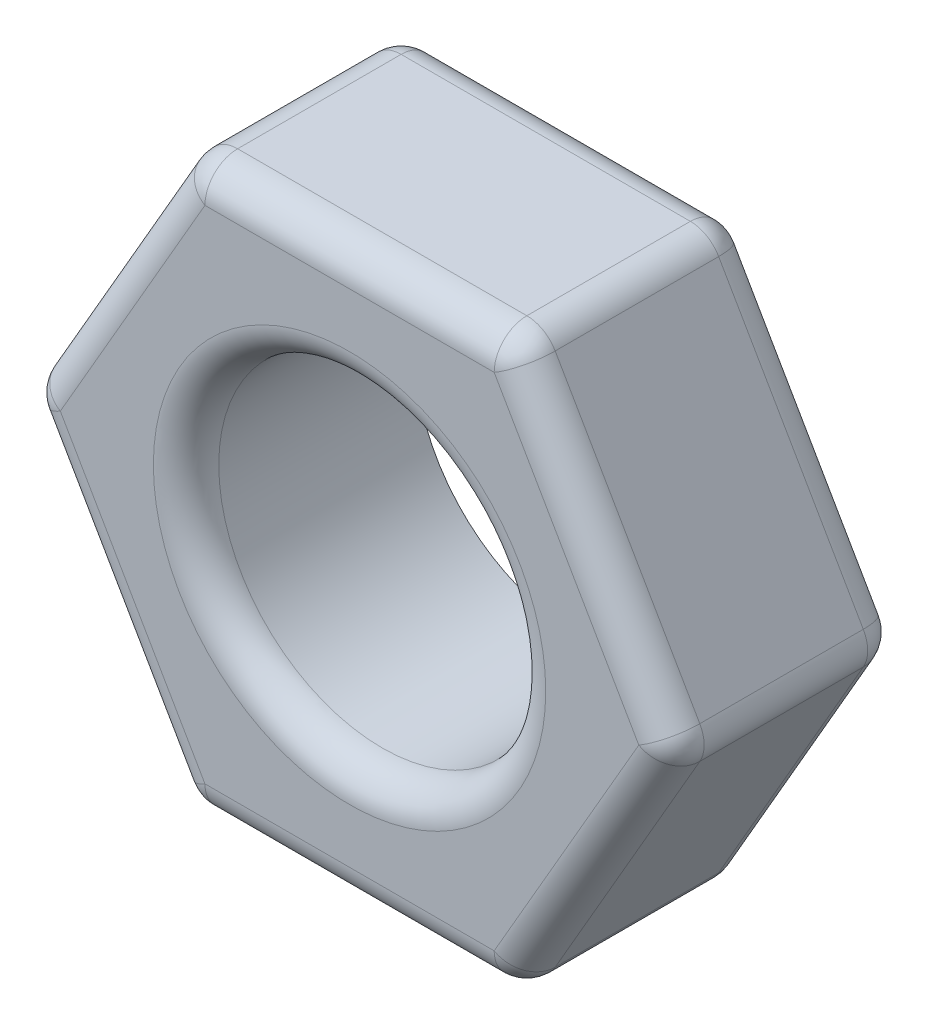
ISO-10303-21;
HEADER;
FILE_DESCRIPTION(('STEP AP214'),'2;1');
FILE_NAME('part.step','',(''),(''),'','','');
FILE_SCHEMA(('AUTOMOTIVE_DESIGN { 1 0 10303 214 1 1 1 1 }'));
ENDSEC;
DATA;
#1=APPLICATION_CONTEXT('core data for automotive mechanical design processes');
#2=APPLICATION_PROTOCOL_DEFINITION('international standard','automotive_design',2000,#1);
#3=PRODUCT_CONTEXT('',#1,'mechanical');
#4=PRODUCT('Part','Part','',(#3));
#5=PRODUCT_RELATED_PRODUCT_CATEGORY('part','',(#4));
#6=PRODUCT_DEFINITION_FORMATION('','',#4);
#7=PRODUCT_DEFINITION_CONTEXT('part definition',#1,'design');
#8=PRODUCT_DEFINITION('design','',#6,#7);
#9=PRODUCT_DEFINITION_SHAPE('','',#8);
#10=(LENGTH_UNIT() NAMED_UNIT(*) SI_UNIT(.MILLI.,.METRE.));
#11=(NAMED_UNIT(*) PLANE_ANGLE_UNIT() SI_UNIT($,.RADIAN.));
#12=(NAMED_UNIT(*) SI_UNIT($,.STERADIAN.) SOLID_ANGLE_UNIT());
#13=UNCERTAINTY_MEASURE_WITH_UNIT(LENGTH_MEASURE(1.E-05),#10,'distance_accuracy_value','');
#14=(GEOMETRIC_REPRESENTATION_CONTEXT(3) GLOBAL_UNCERTAINTY_ASSIGNED_CONTEXT((#13)) GLOBAL_UNIT_ASSIGNED_CONTEXT((#10,
#11,#12)) REPRESENTATION_CONTEXT('',''));
#15=CARTESIAN_POINT('',(0.,0.,0.));
#16=DIRECTION('',(0.,0.,1.));
#17=DIRECTION('',(1.,0.,0.));
#18=AXIS2_PLACEMENT_3D('',#15,#16,#17);
#19=CARTESIAN_POINT('',(0.,0.,7.));
#20=DIRECTION('',(0.,0.,1.));
#21=DIRECTION('',(1.,0.,0.));
#22=AXIS2_PLACEMENT_3D('',#19,#20,#21);
#23=PLANE('',#22);
#24=DIRECTION('',(-0.5,0.866025403784439,0.));
#25=VECTOR('',#24,1.);
#26=CARTESIAN_POINT('',(4.42264973081037,7.66025403784439,7.));
#27=LINE('',#26,#25);
#28=CARTESIAN_POINT('',(8.84529946162075,0.,7.));
#29=VERTEX_POINT('',#28);
#30=CARTESIAN_POINT('',(4.42264973081037,7.66025403784439,7.));
#31=VERTEX_POINT('',#30);
#32=EDGE_CURVE('E54',#29,#31,#27,.T.);
#33=ORIENTED_EDGE('',*,*,#32,.T.);
#34=DIRECTION('',(-1.,0.,0.));
#35=VECTOR('',#34,1.);
#36=CARTESIAN_POINT('',(-4.42264973081037,7.66025403784439,7.));
#37=LINE('',#36,#35);
#38=CARTESIAN_POINT('',(-4.42264973081037,7.66025403784439,7.));
#39=VERTEX_POINT('',#38);
#40=EDGE_CURVE('E280',#31,#39,#37,.T.);
#41=ORIENTED_EDGE('',*,*,#40,.T.);
#42=DIRECTION('',(-0.5,-0.866025403784439,0.));
#43=VECTOR('',#42,1.);
#44=CARTESIAN_POINT('',(-8.84529946162075,0.,7.));
#45=LINE('',#44,#43);
#46=CARTESIAN_POINT('',(-8.84529946162075,0.,7.));
#47=VERTEX_POINT('',#46);
#48=EDGE_CURVE('E305',#39,#47,#45,.T.);
#49=ORIENTED_EDGE('',*,*,#48,.T.);
#50=DIRECTION('',(0.5,-0.866025403784439,0.));
#51=VECTOR('',#50,1.);
#52=CARTESIAN_POINT('',(-4.42264973081038,-7.66025403784439,7.));
#53=LINE('',#52,#51);
#54=CARTESIAN_POINT('',(-4.42264973081037,-7.66025403784439,7.));
#55=VERTEX_POINT('',#54);
#56=EDGE_CURVE('E282',#47,#55,#53,.T.);
#57=ORIENTED_EDGE('',*,*,#56,.T.);
#58=DIRECTION('',(1.,0.,0.));
#59=VECTOR('',#58,1.);
#60=CARTESIAN_POINT('',(4.42264973081037,-7.66025403784439,7.));
#61=LINE('',#60,#59);
#62=CARTESIAN_POINT('',(4.42264973081037,-7.66025403784439,7.));
#63=VERTEX_POINT('',#62);
#64=EDGE_CURVE('E270',#55,#63,#61,.T.);
#65=ORIENTED_EDGE('',*,*,#64,.T.);
#66=DIRECTION('',(0.5,0.866025403784439,0.));
#67=VECTOR('',#66,1.);
#68=CARTESIAN_POINT('',(8.84529946162075,0.,7.));
#69=LINE('',#68,#67);
#70=EDGE_CURVE('E59',#63,#29,#69,.T.);
#71=ORIENTED_EDGE('',*,*,#70,.T.);
#72=EDGE_LOOP('',(#33,#41,#49,#57,#65,#71));
#73=FACE_BOUND('',#72,.T.);
#74=CARTESIAN_POINT('',(0.,0.,7.));
#75=DIRECTION('',(0.,0.,1.));
#76=DIRECTION('',(1.,0.,0.));
#77=AXIS2_PLACEMENT_3D('',#74,#75,#76);
#78=CIRCLE('',#77,6.);
#79=CARTESIAN_POINT('',(6.,0.,7.));
#80=VERTEX_POINT('',#79);
#81=EDGE_CURVE('E398',#80,#80,#78,.F.);
#82=ORIENTED_EDGE('',*,*,#81,.T.);
#83=EDGE_LOOP('',(#82));
#84=FACE_BOUND('',#83,.T.);
#85=ADVANCED_FACE('F37',(#73,#84),#23,.T.);
#86=CARTESIAN_POINT('',(0.,0.,0.));
#87=DIRECTION('',(0.,0.,1.));
#88=DIRECTION('',(1.,0.,0.));
#89=AXIS2_PLACEMENT_3D('',#86,#87,#88);
#90=PLANE('',#89);
#91=DIRECTION('',(-0.5,-0.866025403784439,0.));
#92=VECTOR('',#91,1.);
#93=CARTESIAN_POINT('',(-6.63397459621556,3.83012701892219,0.));
#94=LINE('',#93,#92);
#95=CARTESIAN_POINT('',(-8.84529946162075,0.,0.));
#96=VERTEX_POINT('',#95);
#97=CARTESIAN_POINT('',(-4.42264973081037,7.66025403784439,0.));
#98=VERTEX_POINT('',#97);
#99=EDGE_CURVE('E173',#96,#98,#94,.F.);
#100=ORIENTED_EDGE('',*,*,#99,.T.);
#101=DIRECTION('',(-1.,0.,0.));
#102=VECTOR('',#101,1.);
#103=CARTESIAN_POINT('',(0.,7.66025403784439,0.));
#104=LINE('',#103,#102);
#105=CARTESIAN_POINT('',(4.42264973081037,7.66025403784439,0.));
#106=VERTEX_POINT('',#105);
#107=EDGE_CURVE('E198',#98,#106,#104,.F.);
#108=ORIENTED_EDGE('',*,*,#107,.T.);
#109=DIRECTION('',(-0.5,0.866025403784439,0.));
#110=VECTOR('',#109,1.);
#111=CARTESIAN_POINT('',(6.63397459621556,3.83012701892219,0.));
#112=LINE('',#111,#110);
#113=CARTESIAN_POINT('',(8.84529946162075,0.,0.));
#114=VERTEX_POINT('',#113);
#115=EDGE_CURVE('E323',#106,#114,#112,.F.);
#116=ORIENTED_EDGE('',*,*,#115,.T.);
#117=DIRECTION('',(0.5,0.866025403784439,0.));
#118=VECTOR('',#117,1.);
#119=CARTESIAN_POINT('',(6.63397459621556,-3.83012701892219,0.));
#120=LINE('',#119,#118);
#121=CARTESIAN_POINT('',(4.42264973081037,-7.66025403784439,0.));
#122=VERTEX_POINT('',#121);
#123=EDGE_CURVE('E321',#114,#122,#120,.F.);
#124=ORIENTED_EDGE('',*,*,#123,.T.);
#125=DIRECTION('',(1.,0.,0.));
#126=VECTOR('',#125,1.);
#127=CARTESIAN_POINT('',(0.,-7.66025403784439,0.));
#128=LINE('',#127,#126);
#129=CARTESIAN_POINT('',(-4.42264973081037,-7.66025403784439,0.));
#130=VERTEX_POINT('',#129);
#131=EDGE_CURVE('E319',#122,#130,#128,.F.);
#132=ORIENTED_EDGE('',*,*,#131,.T.);
#133=DIRECTION('',(0.5,-0.866025403784439,0.));
#134=VECTOR('',#133,1.);
#135=CARTESIAN_POINT('',(-6.63397459621556,-3.83012701892219,0.));
#136=LINE('',#135,#134);
#137=EDGE_CURVE('E317',#130,#96,#136,.F.);
#138=ORIENTED_EDGE('',*,*,#137,.T.);
#139=EDGE_LOOP('',(#100,#108,#116,#124,#132,#138));
#140=FACE_BOUND('',#139,.T.);
#141=CARTESIAN_POINT('',(0.,0.,0.));
#142=DIRECTION('',(0.,0.,1.));
#143=DIRECTION('',(1.,0.,0.));
#144=AXIS2_PLACEMENT_3D('',#141,#142,#143);
#145=CIRCLE('',#144,5.);
#146=CARTESIAN_POINT('',(5.,0.,0.));
#147=VERTEX_POINT('',#146);
#148=EDGE_CURVE('E234',#147,#147,#145,.T.);
#149=ORIENTED_EDGE('',*,*,#148,.T.);
#150=EDGE_LOOP('',(#149));
#151=FACE_BOUND('',#150,.T.);
#152=ADVANCED_FACE('F407',(#140,#151),#90,.F.);
#153=CARTESIAN_POINT('',(5.,-8.66025403784439,7.));
#154=DIRECTION('',(-0.866025403784439,0.5,0.));
#155=DIRECTION('',(-0.5,-0.866025403784439,0.));
#156=AXIS2_PLACEMENT_3D('',#153,#154,#155);
#157=PLANE('',#156);
#158=DIRECTION('',(0.,0.,-1.));
#159=VECTOR('',#158,1.);
#160=CARTESIAN_POINT('',(5.28867513459481,-8.16025403784439,7.));
#161=LINE('',#160,#159);
#162=CARTESIAN_POINT('',(5.28867513459481,-8.16025403784439,6.));
#163=VERTEX_POINT('',#162);
#164=CARTESIAN_POINT('',(5.28867513459481,-8.16025403784439,1.));
#165=VERTEX_POINT('',#164);
#166=EDGE_CURVE('E389',#163,#165,#161,.T.);
#167=ORIENTED_EDGE('',*,*,#166,.T.);
#168=DIRECTION('',(0.5,0.866025403784439,0.));
#169=VECTOR('',#168,1.);
#170=CARTESIAN_POINT('',(5.,-8.66025403784439,1.));
#171=LINE('',#170,#169);
#172=CARTESIAN_POINT('',(9.71132486540519,-0.499999999999999,1.));
#173=VERTEX_POINT('',#172);
#174=EDGE_CURVE('E340',#165,#173,#171,.T.);
#175=ORIENTED_EDGE('',*,*,#174,.T.);
#176=DIRECTION('',(0.,0.,-1.));
#177=VECTOR('',#176,1.);
#178=CARTESIAN_POINT('',(9.71132486540519,-0.499999999999999,7.));
#179=LINE('',#178,#177);
#180=CARTESIAN_POINT('',(9.71132486540519,-0.499999999999999,6.));
#181=VERTEX_POINT('',#180);
#182=EDGE_CURVE('E386',#173,#181,#179,.F.);
#183=ORIENTED_EDGE('',*,*,#182,.T.);
#184=DIRECTION('',(0.5,0.866025403784439,0.));
#185=VECTOR('',#184,1.);
#186=CARTESIAN_POINT('',(5.28867513459481,-8.16025403784439,6.));
#187=LINE('',#186,#185);
#188=EDGE_CURVE('E338',#181,#163,#187,.F.);
#189=ORIENTED_EDGE('',*,*,#188,.T.);
#190=EDGE_LOOP('',(#167,#175,#183,#189));
#191=FACE_BOUND('',#190,.T.);
#192=ADVANCED_FACE('F432',(#191),#157,.F.);
#193=CARTESIAN_POINT('',(10.,0.,7.));
#194=DIRECTION('',(-0.866025403784438,-0.5,0.));
#195=DIRECTION('',(0.5,-0.866025403784439,0.));
#196=AXIS2_PLACEMENT_3D('',#193,#194,#195);
#197=PLANE('',#196);
#198=DIRECTION('',(0.,0.,-1.));
#199=VECTOR('',#198,1.);
#200=CARTESIAN_POINT('',(9.71132486540519,0.500000000000002,7.));
#201=LINE('',#200,#199);
#202=CARTESIAN_POINT('',(9.71132486540519,0.500000000000002,6.));
#203=VERTEX_POINT('',#202);
#204=CARTESIAN_POINT('',(9.71132486540519,0.500000000000002,1.));
#205=VERTEX_POINT('',#204);
#206=EDGE_CURVE('E392',#203,#205,#201,.T.);
#207=ORIENTED_EDGE('',*,*,#206,.T.);
#208=DIRECTION('',(-0.5,0.866025403784439,0.));
#209=VECTOR('',#208,1.);
#210=CARTESIAN_POINT('',(10.,0.,1.));
#211=LINE('',#210,#209);
#212=CARTESIAN_POINT('',(5.28867513459481,8.16025403784439,1.));
#213=VERTEX_POINT('',#212);
#214=EDGE_CURVE('E332',#205,#213,#211,.T.);
#215=ORIENTED_EDGE('',*,*,#214,.T.);
#216=DIRECTION('',(0.,0.,-1.));
#217=VECTOR('',#216,1.);
#218=CARTESIAN_POINT('',(5.28867513459481,8.16025403784439,7.));
#219=LINE('',#218,#217);
#220=CARTESIAN_POINT('',(5.28867513459481,8.16025403784439,6.));
#221=VERTEX_POINT('',#220);
#222=EDGE_CURVE('E395',#213,#221,#219,.F.);
#223=ORIENTED_EDGE('',*,*,#222,.T.);
#224=DIRECTION('',(-0.5,0.866025403784439,0.));
#225=VECTOR('',#224,1.);
#226=CARTESIAN_POINT('',(9.71132486540519,0.500000000000001,6.));
#227=LINE('',#226,#225);
#228=EDGE_CURVE('E330',#221,#203,#227,.F.);
#229=ORIENTED_EDGE('',*,*,#228,.T.);
#230=EDGE_LOOP('',(#207,#215,#223,#229));
#231=FACE_BOUND('',#230,.T.);
#232=ADVANCED_FACE('F442',(#231),#197,.F.);
#233=CARTESIAN_POINT('',(5.,8.66025403784439,7.));
#234=DIRECTION('',(0.,-1.,0.));
#235=DIRECTION('',(0.,0.,-1.));
#236=AXIS2_PLACEMENT_3D('',#233,#234,#235);
#237=PLANE('',#236);
#238=DIRECTION('',(0.,0.,-1.));
#239=VECTOR('',#238,1.);
#240=CARTESIAN_POINT('',(4.42264973081037,8.66025403784439,7.));
#241=LINE('',#240,#239);
#242=CARTESIAN_POINT('',(4.42264973081037,8.66025403784439,6.));
#243=VERTEX_POINT('',#242);
#244=CARTESIAN_POINT('',(4.42264973081037,8.66025403784439,1.));
#245=VERTEX_POINT('',#244);
#246=EDGE_CURVE('E169',#243,#245,#241,.T.);
#247=ORIENTED_EDGE('',*,*,#246,.T.);
#248=DIRECTION('',(-1.,0.,0.));
#249=VECTOR('',#248,1.);
#250=CARTESIAN_POINT('',(5.,8.66025403784439,1.));
#251=LINE('',#250,#249);
#252=CARTESIAN_POINT('',(-4.42264973081037,8.66025403784439,1.));
#253=VERTEX_POINT('',#252);
#254=EDGE_CURVE('E164',#245,#253,#251,.T.);
#255=ORIENTED_EDGE('',*,*,#254,.T.);
#256=DIRECTION('',(0.,0.,-1.));
#257=VECTOR('',#256,1.);
#258=CARTESIAN_POINT('',(-4.42264973081037,8.66025403784439,7.));
#259=LINE('',#258,#257);
#260=CARTESIAN_POINT('',(-4.42264973081037,8.66025403784439,6.));
#261=VERTEX_POINT('',#260);
#262=EDGE_CURVE('E167',#253,#261,#259,.F.);
#263=ORIENTED_EDGE('',*,*,#262,.T.);
#264=DIRECTION('',(-1.,0.,0.));
#265=VECTOR('',#264,1.);
#266=CARTESIAN_POINT('',(4.42264973081037,8.66025403784439,6.));
#267=LINE('',#266,#265);
#268=EDGE_CURVE('E174',#261,#243,#267,.F.);
#269=ORIENTED_EDGE('',*,*,#268,.T.);
#270=EDGE_LOOP('',(#247,#255,#263,#269));
#271=FACE_BOUND('',#270,.T.);
#272=ADVANCED_FACE('F166',(#271),#237,.F.);
#273=CARTESIAN_POINT('',(-5.,8.66025403784439,7.));
#274=DIRECTION('',(0.866025403784439,-0.5,0.));
#275=DIRECTION('',(0.5,0.866025403784439,0.));
#276=AXIS2_PLACEMENT_3D('',#273,#274,#275);
#277=PLANE('',#276);
#278=DIRECTION('',(0.,0.,-1.));
#279=VECTOR('',#278,1.);
#280=CARTESIAN_POINT('',(-5.28867513459481,8.16025403784439,7.));
#281=LINE('',#280,#279);
#282=CARTESIAN_POINT('',(-5.28867513459481,8.16025403784439,6.));
#283=VERTEX_POINT('',#282);
#284=CARTESIAN_POINT('',(-5.28867513459481,8.16025403784439,1.));
#285=VERTEX_POINT('',#284);
#286=EDGE_CURVE('E290',#283,#285,#281,.T.);
#287=ORIENTED_EDGE('',*,*,#286,.T.);
#288=DIRECTION('',(-0.5,-0.866025403784439,0.));
#289=VECTOR('',#288,1.);
#290=CARTESIAN_POINT('',(-5.,8.66025403784439,1.));
#291=LINE('',#290,#289);
#292=CARTESIAN_POINT('',(-9.71132486540519,0.499999999999999,1.));
#293=VERTEX_POINT('',#292);
#294=EDGE_CURVE('E11',#285,#293,#291,.T.);
#295=ORIENTED_EDGE('',*,*,#294,.T.);
#296=DIRECTION('',(0.,0.,-1.));
#297=VECTOR('',#296,1.);
#298=CARTESIAN_POINT('',(-9.71132486540519,0.499999999999999,7.));
#299=LINE('',#298,#297);
#300=CARTESIAN_POINT('',(-9.71132486540519,0.499999999999999,6.));
#301=VERTEX_POINT('',#300);
#302=EDGE_CURVE('E292',#293,#301,#299,.F.);
#303=ORIENTED_EDGE('',*,*,#302,.T.);
#304=DIRECTION('',(-0.5,-0.866025403784439,0.));
#305=VECTOR('',#304,1.);
#306=CARTESIAN_POINT('',(-5.28867513459481,8.16025403784439,6.));
#307=LINE('',#306,#305);
#308=EDGE_CURVE('E46',#301,#283,#307,.F.);
#309=ORIENTED_EDGE('',*,*,#308,.T.);
#310=EDGE_LOOP('',(#287,#295,#303,#309));
#311=FACE_BOUND('',#310,.T.);
#312=ADVANCED_FACE('F289',(#311),#277,.F.);
#313=CARTESIAN_POINT('',(-10.,0.,7.));
#314=DIRECTION('',(0.866025403784439,0.5,0.));
#315=DIRECTION('',(-0.5,0.866025403784439,0.));
#316=AXIS2_PLACEMENT_3D('',#313,#314,#315);
#317=PLANE('',#316);
#318=DIRECTION('',(0.,0.,-1.));
#319=VECTOR('',#318,1.);
#320=CARTESIAN_POINT('',(-9.71132486540519,-0.500000000000002,7.));
#321=LINE('',#320,#319);
#322=CARTESIAN_POINT('',(-9.71132486540519,-0.500000000000002,6.));
#323=VERTEX_POINT('',#322);
#324=CARTESIAN_POINT('',(-9.71132486540519,-0.500000000000002,1.));
#325=VERTEX_POINT('',#324);
#326=EDGE_CURVE('E371',#323,#325,#321,.T.);
#327=ORIENTED_EDGE('',*,*,#326,.T.);
#328=DIRECTION('',(0.5,-0.866025403784439,0.));
#329=VECTOR('',#328,1.);
#330=CARTESIAN_POINT('',(-10.,0.,1.));
#331=LINE('',#330,#329);
#332=CARTESIAN_POINT('',(-5.28867513459481,-8.16025403784439,1.));
#333=VERTEX_POINT('',#332);
#334=EDGE_CURVE('E354',#325,#333,#331,.T.);
#335=ORIENTED_EDGE('',*,*,#334,.T.);
#336=DIRECTION('',(0.,0.,-1.));
#337=VECTOR('',#336,1.);
#338=CARTESIAN_POINT('',(-5.28867513459481,-8.16025403784439,7.));
#339=LINE('',#338,#337);
#340=CARTESIAN_POINT('',(-5.28867513459481,-8.16025403784439,6.));
#341=VERTEX_POINT('',#340);
#342=EDGE_CURVE('E296',#333,#341,#339,.F.);
#343=ORIENTED_EDGE('',*,*,#342,.T.);
#344=DIRECTION('',(0.5,-0.866025403784439,0.));
#345=VECTOR('',#344,1.);
#346=CARTESIAN_POINT('',(-9.71132486540519,-0.5,6.));
#347=LINE('',#346,#345);
#348=EDGE_CURVE('E352',#341,#323,#347,.F.);
#349=ORIENTED_EDGE('',*,*,#348,.T.);
#350=EDGE_LOOP('',(#327,#335,#343,#349));
#351=FACE_BOUND('',#350,.T.);
#352=ADVANCED_FACE('F423',(#351),#317,.F.);
#353=CARTESIAN_POINT('',(-5.,-8.66025403784439,7.));
#354=DIRECTION('',(0.,1.,0.));
#355=DIRECTION('',(-1.,0.,0.));
#356=AXIS2_PLACEMENT_3D('',#353,#354,#355);
#357=PLANE('',#356);
#358=DIRECTION('',(0.,0.,-1.));
#359=VECTOR('',#358,1.);
#360=CARTESIAN_POINT('',(-4.42264973081037,-8.66025403784439,7.));
#361=LINE('',#360,#359);
#362=CARTESIAN_POINT('',(-4.42264973081037,-8.66025403784439,6.));
#363=VERTEX_POINT('',#362);
#364=CARTESIAN_POINT('',(-4.42264973081037,-8.66025403784439,1.));
#365=VERTEX_POINT('',#364);
#366=EDGE_CURVE('E379',#363,#365,#361,.T.);
#367=ORIENTED_EDGE('',*,*,#366,.T.);
#368=DIRECTION('',(1.,0.,0.));
#369=VECTOR('',#368,1.);
#370=CARTESIAN_POINT('',(-5.,-8.66025403784439,1.));
#371=LINE('',#370,#369);
#372=CARTESIAN_POINT('',(4.42264973081037,-8.66025403784439,1.));
#373=VERTEX_POINT('',#372);
#374=EDGE_CURVE('E346',#365,#373,#371,.T.);
#375=ORIENTED_EDGE('',*,*,#374,.T.);
#376=DIRECTION('',(0.,0.,-1.));
#377=VECTOR('',#376,1.);
#378=CARTESIAN_POINT('',(4.42264973081037,-8.66025403784439,7.));
#379=LINE('',#378,#377);
#380=CARTESIAN_POINT('',(4.42264973081037,-8.66025403784439,6.));
#381=VERTEX_POINT('',#380);
#382=EDGE_CURVE('E374',#373,#381,#379,.F.);
#383=ORIENTED_EDGE('',*,*,#382,.T.);
#384=DIRECTION('',(1.,0.,0.));
#385=VECTOR('',#384,1.);
#386=CARTESIAN_POINT('',(-4.42264973081037,-8.66025403784439,6.));
#387=LINE('',#386,#385);
#388=EDGE_CURVE('E271',#381,#363,#387,.F.);
#389=ORIENTED_EDGE('',*,*,#388,.T.);
#390=EDGE_LOOP('',(#367,#375,#383,#389));
#391=FACE_BOUND('',#390,.T.);
#392=ADVANCED_FACE('F412',(#391),#357,.F.);
#393=CARTESIAN_POINT('',(0.,0.,7.));
#394=DIRECTION('',(0.,0.,-1.));
#395=DIRECTION('',(-1.,0.,0.));
#396=AXIS2_PLACEMENT_3D('',#393,#394,#395);
#397=CYLINDRICAL_SURFACE('',#396,5.);
#398=CARTESIAN_POINT('',(0.,0.,6.));
#399=DIRECTION('',(0.,0.,1.));
#400=DIRECTION('',(1.,0.,0.));
#401=AXIS2_PLACEMENT_3D('',#398,#399,#400);
#402=CIRCLE('',#401,5.);
#403=CARTESIAN_POINT('',(5.,0.,6.));
#404=VERTEX_POINT('',#403);
#405=EDGE_CURVE('E401',#404,#404,#402,.T.);
#406=ORIENTED_EDGE('',*,*,#405,.T.);
#407=EDGE_LOOP('',(#406));
#408=FACE_BOUND('',#407,.T.);
#409=ORIENTED_EDGE('',*,*,#148,.F.);
#410=EDGE_LOOP('',(#409));
#411=FACE_BOUND('',#410,.T.);
#412=ADVANCED_FACE('F409',(#408,#411),#397,.F.);
#413=CARTESIAN_POINT('',(0.,0.,6.));
#414=DIRECTION('',(0.,0.,1.));
#415=DIRECTION('',(1.,0.,0.));
#416=AXIS2_PLACEMENT_3D('',#413,#414,#415);
#417=TOROIDAL_SURFACE('',#416,6.,1.);
#418=ORIENTED_EDGE('',*,*,#81,.F.);
#419=EDGE_LOOP('',(#418));
#420=FACE_BOUND('',#419,.T.);
#421=ORIENTED_EDGE('',*,*,#405,.F.);
#422=EDGE_LOOP('',(#421));
#423=FACE_BOUND('',#422,.T.);
#424=ADVANCED_FACE('F411',(#420,#423),#417,.T.);
#425=CARTESIAN_POINT('',(8.84529946162075,0.,7.));
#426=DIRECTION('',(0.,0.,-1.));
#427=DIRECTION('',(-1.,0.,0.));
#428=AXIS2_PLACEMENT_3D('',#425,#426,#427);
#429=CYLINDRICAL_SURFACE('',#428,1.);
#430=ORIENTED_EDGE('',*,*,#182,.F.);
#431=CARTESIAN_POINT('',(8.84529946162075,0.,1.));
#432=DIRECTION('',(0.,0.,-1.));
#433=DIRECTION('',(-1.,0.,0.));
#434=AXIS2_PLACEMENT_3D('',#431,#432,#433);
#435=CIRCLE('',#434,1.);
#436=EDGE_CURVE('E336',#173,#205,#435,.F.);
#437=ORIENTED_EDGE('',*,*,#436,.T.);
#438=ORIENTED_EDGE('',*,*,#206,.F.);
#439=CARTESIAN_POINT('',(8.84529946162075,0.,6.));
#440=DIRECTION('',(0.,0.,-1.));
#441=DIRECTION('',(-1.,0.,0.));
#442=AXIS2_PLACEMENT_3D('',#439,#440,#441);
#443=CIRCLE('',#442,1.);
#444=EDGE_CURVE('E334',#203,#181,#443,.T.);
#445=ORIENTED_EDGE('',*,*,#444,.T.);
#446=EDGE_LOOP('',(#430,#437,#438,#445));
#447=FACE_BOUND('',#446,.T.);
#448=ADVANCED_FACE('F419',(#447),#429,.T.);
#449=CARTESIAN_POINT('',(4.42264973081037,-7.66025403784439,7.));
#450=DIRECTION('',(0.,0.,-1.));
#451=DIRECTION('',(-1.,0.,0.));
#452=AXIS2_PLACEMENT_3D('',#449,#450,#451);
#453=CYLINDRICAL_SURFACE('',#452,1.);
#454=ORIENTED_EDGE('',*,*,#382,.F.);
#455=CARTESIAN_POINT('',(4.42264973081037,-7.66025403784439,1.));
#456=DIRECTION('',(0.,0.,-1.));
#457=DIRECTION('',(-1.,0.,0.));
#458=AXIS2_PLACEMENT_3D('',#455,#456,#457);
#459=CIRCLE('',#458,1.);
#460=EDGE_CURVE('E343',#373,#165,#459,.F.);
#461=ORIENTED_EDGE('',*,*,#460,.T.);
#462=ORIENTED_EDGE('',*,*,#166,.F.);
#463=CARTESIAN_POINT('',(4.42264973081037,-7.66025403784439,6.));
#464=DIRECTION('',(0.,0.,-1.));
#465=DIRECTION('',(-1.,0.,0.));
#466=AXIS2_PLACEMENT_3D('',#463,#464,#465);
#467=CIRCLE('',#466,1.);
#468=EDGE_CURVE('E274',#163,#381,#467,.T.);
#469=ORIENTED_EDGE('',*,*,#468,.T.);
#470=EDGE_LOOP('',(#454,#461,#462,#469));
#471=FACE_BOUND('',#470,.T.);
#472=ADVANCED_FACE('F451',(#471),#453,.T.);
#473=CARTESIAN_POINT('',(-4.42264973081037,-7.66025403784439,7.));
#474=DIRECTION('',(0.,0.,-1.));
#475=DIRECTION('',(-1.,0.,0.));
#476=AXIS2_PLACEMENT_3D('',#473,#474,#475);
#477=CYLINDRICAL_SURFACE('',#476,1.);
#478=ORIENTED_EDGE('',*,*,#342,.F.);
#479=CARTESIAN_POINT('',(-4.42264973081037,-7.66025403784439,1.));
#480=DIRECTION('',(0.,0.,-1.));
#481=DIRECTION('',(-1.,0.,0.));
#482=AXIS2_PLACEMENT_3D('',#479,#480,#481);
#483=CIRCLE('',#482,1.);
#484=EDGE_CURVE('E350',#333,#365,#483,.F.);
#485=ORIENTED_EDGE('',*,*,#484,.T.);
#486=ORIENTED_EDGE('',*,*,#366,.F.);
#487=CARTESIAN_POINT('',(-4.42264973081037,-7.66025403784439,6.));
#488=DIRECTION('',(0.,0.,-1.));
#489=DIRECTION('',(-1.,0.,0.));
#490=AXIS2_PLACEMENT_3D('',#487,#488,#489);
#491=CIRCLE('',#490,1.);
#492=EDGE_CURVE('E348',#363,#341,#491,.T.);
#493=ORIENTED_EDGE('',*,*,#492,.T.);
#494=EDGE_LOOP('',(#478,#485,#486,#493));
#495=FACE_BOUND('',#494,.T.);
#496=ADVANCED_FACE('F455',(#495),#477,.T.);
#497=CARTESIAN_POINT('',(-8.84529946162075,0.,7.));
#498=DIRECTION('',(0.,0.,-1.));
#499=DIRECTION('',(-1.,0.,0.));
#500=AXIS2_PLACEMENT_3D('',#497,#498,#499);
#501=CYLINDRICAL_SURFACE('',#500,1.);
#502=ORIENTED_EDGE('',*,*,#302,.F.);
#503=CARTESIAN_POINT('',(-8.84529946162075,0.,1.));
#504=DIRECTION('',(0.,0.,-1.));
#505=DIRECTION('',(-1.,0.,0.));
#506=AXIS2_PLACEMENT_3D('',#503,#504,#505);
#507=CIRCLE('',#506,1.);
#508=EDGE_CURVE('E307',#293,#325,#507,.F.);
#509=ORIENTED_EDGE('',*,*,#508,.T.);
#510=ORIENTED_EDGE('',*,*,#326,.F.);
#511=CARTESIAN_POINT('',(-8.84529946162075,0.,6.));
#512=DIRECTION('',(0.,0.,-1.));
#513=DIRECTION('',(-1.,0.,0.));
#514=AXIS2_PLACEMENT_3D('',#511,#512,#513);
#515=CIRCLE('',#514,1.);
#516=EDGE_CURVE('E356',#323,#301,#515,.T.);
#517=ORIENTED_EDGE('',*,*,#516,.T.);
#518=EDGE_LOOP('',(#502,#509,#510,#517));
#519=FACE_BOUND('',#518,.T.);
#520=ADVANCED_FACE('F368',(#519),#501,.T.);
#521=CARTESIAN_POINT('',(-4.42264973081037,7.66025403784439,7.));
#522=DIRECTION('',(0.,0.,-1.));
#523=DIRECTION('',(-1.,0.,0.));
#524=AXIS2_PLACEMENT_3D('',#521,#522,#523);
#525=CYLINDRICAL_SURFACE('',#524,1.);
#526=ORIENTED_EDGE('',*,*,#262,.F.);
#527=CARTESIAN_POINT('',(-4.42264973081037,7.66025403784439,1.));
#528=DIRECTION('',(0.,0.,-1.));
#529=DIRECTION('',(-1.,0.,0.));
#530=AXIS2_PLACEMENT_3D('',#527,#528,#529);
#531=CIRCLE('',#530,1.);
#532=EDGE_CURVE('E182',#253,#285,#531,.F.);
#533=ORIENTED_EDGE('',*,*,#532,.T.);
#534=ORIENTED_EDGE('',*,*,#286,.F.);
#535=CARTESIAN_POINT('',(-4.42264973081037,7.66025403784439,6.));
#536=DIRECTION('',(0.,0.,-1.));
#537=DIRECTION('',(-1.,0.,0.));
#538=AXIS2_PLACEMENT_3D('',#535,#536,#537);
#539=CIRCLE('',#538,1.);
#540=EDGE_CURVE('E185',#283,#261,#539,.T.);
#541=ORIENTED_EDGE('',*,*,#540,.T.);
#542=EDGE_LOOP('',(#526,#533,#534,#541));
#543=FACE_BOUND('',#542,.T.);
#544=ADVANCED_FACE('F180',(#543),#525,.T.);
#545=CARTESIAN_POINT('',(4.42264973081037,7.66025403784439,7.));
#546=DIRECTION('',(0.,0.,-1.));
#547=DIRECTION('',(-1.,0.,0.));
#548=AXIS2_PLACEMENT_3D('',#545,#546,#547);
#549=CYLINDRICAL_SURFACE('',#548,1.);
#550=ORIENTED_EDGE('',*,*,#222,.F.);
#551=CARTESIAN_POINT('',(4.42264973081037,7.66025403784439,1.));
#552=DIRECTION('',(0.,0.,-1.));
#553=DIRECTION('',(-1.,0.,0.));
#554=AXIS2_PLACEMENT_3D('',#551,#552,#553);
#555=CIRCLE('',#554,1.);
#556=EDGE_CURVE('E328',#213,#245,#555,.F.);
#557=ORIENTED_EDGE('',*,*,#556,.T.);
#558=ORIENTED_EDGE('',*,*,#246,.F.);
#559=CARTESIAN_POINT('',(4.42264973081037,7.66025403784439,6.));
#560=DIRECTION('',(0.,0.,-1.));
#561=DIRECTION('',(-1.,0.,0.));
#562=AXIS2_PLACEMENT_3D('',#559,#560,#561);
#563=CIRCLE('',#562,1.);
#564=EDGE_CURVE('E326',#243,#221,#563,.T.);
#565=ORIENTED_EDGE('',*,*,#564,.T.);
#566=EDGE_LOOP('',(#550,#557,#558,#565));
#567=FACE_BOUND('',#566,.T.);
#568=ADVANCED_FACE('F464',(#567),#549,.T.);
#569=CARTESIAN_POINT('',(4.42264973081037,-7.66025403784439,1.));
#570=DIRECTION('',(0.,0.,1.));
#571=DIRECTION('',(1.,0.,0.));
#572=AXIS2_PLACEMENT_3D('',#569,#570,#571);
#573=SPHERICAL_SURFACE('',#572,1.);
#574=CARTESIAN_POINT('',(4.42264973081037,-7.66025403784439,1.));
#575=DIRECTION('',(0.499999999999999,0.866025403784439,0.));
#576=DIRECTION('',(-0.866025403784439,0.499999999999999,0.));
#577=AXIS2_PLACEMENT_3D('',#574,#575,#576);
#578=CIRCLE('',#577,1.);
#579=EDGE_CURVE('E228',#165,#122,#578,.T.);
#580=ORIENTED_EDGE('',*,*,#579,.F.);
#581=ORIENTED_EDGE('',*,*,#460,.F.);
#582=CARTESIAN_POINT('',(4.42264973081037,-7.66025403784439,1.));
#583=DIRECTION('',(-1.,0.,0.));
#584=DIRECTION('',(0.,0.,1.));
#585=AXIS2_PLACEMENT_3D('',#582,#583,#584);
#586=CIRCLE('',#585,1.);
#587=EDGE_CURVE('E231',#122,#373,#586,.T.);
#588=ORIENTED_EDGE('',*,*,#587,.F.);
#589=EDGE_LOOP('',(#580,#581,#588));
#590=FACE_BOUND('',#589,.T.);
#591=ADVANCED_FACE('F467',(#590),#573,.T.);
#592=CARTESIAN_POINT('',(-5.,-7.66025403784439,1.));
#593=DIRECTION('',(1.,0.,0.));
#594=DIRECTION('',(0.,1.,0.));
#595=AXIS2_PLACEMENT_3D('',#592,#593,#594);
#596=CYLINDRICAL_SURFACE('',#595,1.);
#597=ORIENTED_EDGE('',*,*,#587,.T.);
#598=ORIENTED_EDGE('',*,*,#374,.F.);
#599=CARTESIAN_POINT('',(-4.42264973081037,-7.66025403784439,1.));
#600=DIRECTION('',(-1.,0.,0.));
#601=DIRECTION('',(0.,0.,1.));
#602=AXIS2_PLACEMENT_3D('',#599,#600,#601);
#603=CIRCLE('',#602,1.);
#604=EDGE_CURVE('E225',#130,#365,#603,.T.);
#605=ORIENTED_EDGE('',*,*,#604,.F.);
#606=ORIENTED_EDGE('',*,*,#131,.F.);
#607=EDGE_LOOP('',(#597,#598,#605,#606));
#608=FACE_BOUND('',#607,.T.);
#609=ADVANCED_FACE('F504',(#608),#596,.T.);
#610=CARTESIAN_POINT('',(4.13397459621556,-8.16025403784439,1.));
#611=DIRECTION('',(0.5,0.866025403784439,0.));
#612=DIRECTION('',(-0.866025403784439,0.5,0.));
#613=AXIS2_PLACEMENT_3D('',#610,#611,#612);
#614=CYLINDRICAL_SURFACE('',#613,1.);
#615=ORIENTED_EDGE('',*,*,#579,.T.);
#616=ORIENTED_EDGE('',*,*,#123,.F.);
#617=CARTESIAN_POINT('',(8.84529946162075,0.,1.));
#618=DIRECTION('',(0.5,0.866025403784439,0.));
#619=DIRECTION('',(-0.866025403784439,0.5,0.));
#620=AXIS2_PLACEMENT_3D('',#617,#618,#619);
#621=CIRCLE('',#620,1.);
#622=EDGE_CURVE('E222',#173,#114,#621,.T.);
#623=ORIENTED_EDGE('',*,*,#622,.F.);
#624=ORIENTED_EDGE('',*,*,#174,.F.);
#625=EDGE_LOOP('',(#615,#616,#623,#624));
#626=FACE_BOUND('',#625,.T.);
#627=ADVANCED_FACE('F500',(#626),#614,.T.);
#628=CARTESIAN_POINT('',(-4.42264973081037,-7.66025403784439,1.));
#629=DIRECTION('',(0.,0.,1.));
#630=DIRECTION('',(1.,0.,0.));
#631=AXIS2_PLACEMENT_3D('',#628,#629,#630);
#632=SPHERICAL_SURFACE('',#631,1.);
#633=ORIENTED_EDGE('',*,*,#604,.T.);
#634=ORIENTED_EDGE('',*,*,#484,.F.);
#635=CARTESIAN_POINT('',(-4.42264973081037,-7.66025403784439,1.));
#636=DIRECTION('',(-0.500000000000001,0.866025403784438,0.));
#637=DIRECTION('',(-0.866025403784438,-0.500000000000001,0.));
#638=AXIS2_PLACEMENT_3D('',#635,#636,#637);
#639=CIRCLE('',#638,1.);
#640=EDGE_CURVE('E219',#130,#333,#639,.T.);
#641=ORIENTED_EDGE('',*,*,#640,.F.);
#642=EDGE_LOOP('',(#633,#634,#641));
#643=FACE_BOUND('',#642,.T.);
#644=ADVANCED_FACE('F496',(#643),#632,.T.);
#645=CARTESIAN_POINT('',(8.84529946162075,0.,1.));
#646=DIRECTION('',(0.,0.,1.));
#647=DIRECTION('',(1.,0.,0.));
#648=AXIS2_PLACEMENT_3D('',#645,#646,#647);
#649=SPHERICAL_SURFACE('',#648,1.);
#650=ORIENTED_EDGE('',*,*,#436,.F.);
#651=ORIENTED_EDGE('',*,*,#622,.T.);
#652=CARTESIAN_POINT('',(8.84529946162075,0.,1.));
#653=DIRECTION('',(-0.5,0.866025403784439,0.));
#654=DIRECTION('',(-0.866025403784439,-0.5,0.));
#655=AXIS2_PLACEMENT_3D('',#652,#653,#654);
#656=CIRCLE('',#655,1.);
#657=EDGE_CURVE('E216',#205,#114,#656,.T.);
#658=ORIENTED_EDGE('',*,*,#657,.F.);
#659=EDGE_LOOP('',(#650,#651,#658));
#660=FACE_BOUND('',#659,.T.);
#661=ADVANCED_FACE('F492',(#660),#649,.T.);
#662=CARTESIAN_POINT('',(-9.13397459621556,0.499999999999998,1.));
#663=DIRECTION('',(0.5,-0.866025403784439,0.));
#664=DIRECTION('',(0.866025403784439,0.5,0.));
#665=AXIS2_PLACEMENT_3D('',#662,#663,#664);
#666=CYLINDRICAL_SURFACE('',#665,1.);
#667=ORIENTED_EDGE('',*,*,#640,.T.);
#668=ORIENTED_EDGE('',*,*,#334,.F.);
#669=CARTESIAN_POINT('',(-8.84529946162075,0.,1.));
#670=DIRECTION('',(-0.5,0.866025403784439,0.));
#671=DIRECTION('',(-0.866025403784439,-0.5,0.));
#672=AXIS2_PLACEMENT_3D('',#669,#670,#671);
#673=CIRCLE('',#672,1.);
#674=EDGE_CURVE('E213',#96,#325,#673,.T.);
#675=ORIENTED_EDGE('',*,*,#674,.F.);
#676=ORIENTED_EDGE('',*,*,#137,.F.);
#677=EDGE_LOOP('',(#667,#668,#675,#676));
#678=FACE_BOUND('',#677,.T.);
#679=ADVANCED_FACE('F488',(#678),#666,.T.);
#680=CARTESIAN_POINT('',(9.13397459621556,-0.499999999999999,1.));
#681=DIRECTION('',(-0.5,0.866025403784439,0.));
#682=DIRECTION('',(-0.866025403784438,-0.5,0.));
#683=AXIS2_PLACEMENT_3D('',#680,#681,#682);
#684=CYLINDRICAL_SURFACE('',#683,1.);
#685=ORIENTED_EDGE('',*,*,#657,.T.);
#686=ORIENTED_EDGE('',*,*,#115,.F.);
#687=CARTESIAN_POINT('',(4.42264973081037,7.66025403784439,1.));
#688=DIRECTION('',(-0.5,0.866025403784438,0.));
#689=DIRECTION('',(-0.866025403784438,-0.5,0.));
#690=AXIS2_PLACEMENT_3D('',#687,#688,#689);
#691=CIRCLE('',#690,1.);
#692=EDGE_CURVE('E210',#213,#106,#691,.T.);
#693=ORIENTED_EDGE('',*,*,#692,.F.);
#694=ORIENTED_EDGE('',*,*,#214,.F.);
#695=EDGE_LOOP('',(#685,#686,#693,#694));
#696=FACE_BOUND('',#695,.T.);
#697=ADVANCED_FACE('F484',(#696),#684,.T.);
#698=CARTESIAN_POINT('',(-8.84529946162075,0.,1.));
#699=DIRECTION('',(0.,0.,1.));
#700=DIRECTION('',(1.,0.,0.));
#701=AXIS2_PLACEMENT_3D('',#698,#699,#700);
#702=SPHERICAL_SURFACE('',#701,1.);
#703=ORIENTED_EDGE('',*,*,#674,.T.);
#704=ORIENTED_EDGE('',*,*,#508,.F.);
#705=CARTESIAN_POINT('',(-8.84529946162075,0.,1.));
#706=DIRECTION('',(0.5,0.866025403784439,0.));
#707=DIRECTION('',(-0.866025403784439,0.5,0.));
#708=AXIS2_PLACEMENT_3D('',#705,#706,#707);
#709=CIRCLE('',#708,1.);
#710=EDGE_CURVE('E207',#96,#293,#709,.T.);
#711=ORIENTED_EDGE('',*,*,#710,.F.);
#712=EDGE_LOOP('',(#703,#704,#711));
#713=FACE_BOUND('',#712,.T.);
#714=ADVANCED_FACE('F480',(#713),#702,.T.);
#715=CARTESIAN_POINT('',(4.42264973081037,7.66025403784439,1.));
#716=DIRECTION('',(0.,0.,1.));
#717=DIRECTION('',(1.,0.,0.));
#718=AXIS2_PLACEMENT_3D('',#715,#716,#717);
#719=SPHERICAL_SURFACE('',#718,1.);
#720=ORIENTED_EDGE('',*,*,#556,.F.);
#721=ORIENTED_EDGE('',*,*,#692,.T.);
#722=CARTESIAN_POINT('',(4.42264973081037,7.66025403784439,1.));
#723=DIRECTION('',(-1.,0.,0.));
#724=DIRECTION('',(0.,0.,1.));
#725=AXIS2_PLACEMENT_3D('',#722,#723,#724);
#726=CIRCLE('',#725,1.);
#727=EDGE_CURVE('E200',#245,#106,#726,.T.);
#728=ORIENTED_EDGE('',*,*,#727,.F.);
#729=EDGE_LOOP('',(#720,#721,#728));
#730=FACE_BOUND('',#729,.T.);
#731=ADVANCED_FACE('F476',(#730),#719,.T.);
#732=CARTESIAN_POINT('',(-4.13397459621556,8.16025403784439,1.));
#733=DIRECTION('',(-0.5,-0.866025403784439,0.));
#734=DIRECTION('',(0.866025403784439,-0.5,0.));
#735=AXIS2_PLACEMENT_3D('',#732,#733,#734);
#736=CYLINDRICAL_SURFACE('',#735,1.);
#737=ORIENTED_EDGE('',*,*,#710,.T.);
#738=ORIENTED_EDGE('',*,*,#294,.F.);
#739=CARTESIAN_POINT('',(-4.42264973081037,7.66025403784439,1.));
#740=DIRECTION('',(0.499999999999999,0.866025403784439,0.));
#741=DIRECTION('',(-0.866025403784439,0.499999999999999,0.));
#742=AXIS2_PLACEMENT_3D('',#739,#740,#741);
#743=CIRCLE('',#742,1.);
#744=EDGE_CURVE('E192',#98,#285,#743,.T.);
#745=ORIENTED_EDGE('',*,*,#744,.F.);
#746=ORIENTED_EDGE('',*,*,#99,.F.);
#747=EDGE_LOOP('',(#737,#738,#745,#746));
#748=FACE_BOUND('',#747,.T.);
#749=ADVANCED_FACE('F473',(#748),#736,.T.);
#750=CARTESIAN_POINT('',(5.,7.66025403784439,1.));
#751=DIRECTION('',(-1.,0.,0.));
#752=DIRECTION('',(0.,0.,1.));
#753=AXIS2_PLACEMENT_3D('',#750,#751,#752);
#754=CYLINDRICAL_SURFACE('',#753,1.);
#755=ORIENTED_EDGE('',*,*,#727,.T.);
#756=ORIENTED_EDGE('',*,*,#107,.F.);
#757=CARTESIAN_POINT('',(-4.42264973081037,7.66025403784439,1.));
#758=DIRECTION('',(-1.,0.,0.));
#759=DIRECTION('',(0.,0.,1.));
#760=AXIS2_PLACEMENT_3D('',#757,#758,#759);
#761=CIRCLE('',#760,1.);
#762=EDGE_CURVE('E190',#253,#98,#761,.T.);
#763=ORIENTED_EDGE('',*,*,#762,.F.);
#764=ORIENTED_EDGE('',*,*,#254,.F.);
#765=EDGE_LOOP('',(#755,#756,#763,#764));
#766=FACE_BOUND('',#765,.T.);
#767=ADVANCED_FACE('F196',(#766),#754,.T.);
#768=CARTESIAN_POINT('',(-4.42264973081037,7.66025403784439,1.));
#769=DIRECTION('',(0.,0.,1.));
#770=DIRECTION('',(1.,0.,0.));
#771=AXIS2_PLACEMENT_3D('',#768,#769,#770);
#772=SPHERICAL_SURFACE('',#771,1.);
#773=ORIENTED_EDGE('',*,*,#744,.T.);
#774=ORIENTED_EDGE('',*,*,#532,.F.);
#775=ORIENTED_EDGE('',*,*,#762,.T.);
#776=EDGE_LOOP('',(#773,#774,#775));
#777=FACE_BOUND('',#776,.T.);
#778=ADVANCED_FACE('F189',(#777),#772,.T.);
#779=CARTESIAN_POINT('',(4.42264973081037,-7.66025403784439,6.));
#780=DIRECTION('',(0.,0.,1.));
#781=DIRECTION('',(1.,0.,0.));
#782=AXIS2_PLACEMENT_3D('',#779,#780,#781);
#783=SPHERICAL_SURFACE('',#782,1.);
#784=CARTESIAN_POINT('',(4.42264973081037,-7.66025403784439,6.));
#785=DIRECTION('',(-1.,0.,0.));
#786=DIRECTION('',(0.,0.,1.));
#787=AXIS2_PLACEMENT_3D('',#784,#785,#786);
#788=CIRCLE('',#787,1.);
#789=EDGE_CURVE('E203',#381,#63,#788,.T.);
#790=ORIENTED_EDGE('',*,*,#789,.F.);
#791=ORIENTED_EDGE('',*,*,#468,.F.);
#792=CARTESIAN_POINT('',(4.42264973081037,-7.66025403784439,6.));
#793=DIRECTION('',(0.499999999999999,0.866025403784439,0.));
#794=DIRECTION('',(-0.866025403784439,0.499999999999999,0.));
#795=AXIS2_PLACEMENT_3D('',#792,#793,#794);
#796=CIRCLE('',#795,1.);
#797=EDGE_CURVE('E41',#63,#163,#796,.T.);
#798=ORIENTED_EDGE('',*,*,#797,.F.);
#799=EDGE_LOOP('',(#790,#791,#798));
#800=FACE_BOUND('',#799,.T.);
#801=ADVANCED_FACE('F39',(#800),#783,.T.);
#802=CARTESIAN_POINT('',(6.63397459621556,-3.83012701892219,6.));
#803=DIRECTION('',(-0.5,-0.866025403784439,0.));
#804=DIRECTION('',(0.866025403784439,-0.5,0.));
#805=AXIS2_PLACEMENT_3D('',#802,#803,#804);
#806=CYLINDRICAL_SURFACE('',#805,1.);
#807=ORIENTED_EDGE('',*,*,#797,.T.);
#808=ORIENTED_EDGE('',*,*,#188,.F.);
#809=CARTESIAN_POINT('',(8.84529946162075,0.,6.));
#810=DIRECTION('',(0.500000000000001,0.866025403784438,0.));
#811=DIRECTION('',(-0.866025403784438,0.500000000000001,0.));
#812=AXIS2_PLACEMENT_3D('',#809,#810,#811);
#813=CIRCLE('',#812,1.);
#814=EDGE_CURVE('E260',#29,#181,#813,.T.);
#815=ORIENTED_EDGE('',*,*,#814,.F.);
#816=ORIENTED_EDGE('',*,*,#70,.F.);
#817=EDGE_LOOP('',(#807,#808,#815,#816));
#818=FACE_BOUND('',#817,.T.);
#819=ADVANCED_FACE('F277',(#818),#806,.T.);
#820=CARTESIAN_POINT('',(0.,-7.66025403784439,6.));
#821=DIRECTION('',(-1.,0.,0.));
#822=DIRECTION('',(0.,-1.,0.));
#823=AXIS2_PLACEMENT_3D('',#820,#821,#822);
#824=CYLINDRICAL_SURFACE('',#823,1.);
#825=ORIENTED_EDGE('',*,*,#789,.T.);
#826=ORIENTED_EDGE('',*,*,#64,.F.);
#827=CARTESIAN_POINT('',(-4.42264973081037,-7.66025403784439,6.));
#828=DIRECTION('',(-1.,0.,0.));
#829=DIRECTION('',(0.,0.,1.));
#830=AXIS2_PLACEMENT_3D('',#827,#828,#829);
#831=CIRCLE('',#830,1.);
#832=EDGE_CURVE('E257',#363,#55,#831,.T.);
#833=ORIENTED_EDGE('',*,*,#832,.F.);
#834=ORIENTED_EDGE('',*,*,#388,.F.);
#835=EDGE_LOOP('',(#825,#826,#833,#834));
#836=FACE_BOUND('',#835,.T.);
#837=ADVANCED_FACE('F268',(#836),#824,.T.);
#838=CARTESIAN_POINT('',(8.84529946162075,0.,6.));
#839=DIRECTION('',(0.,0.,1.));
#840=DIRECTION('',(1.,0.,0.));
#841=AXIS2_PLACEMENT_3D('',#838,#839,#840);
#842=SPHERICAL_SURFACE('',#841,1.);
#843=ORIENTED_EDGE('',*,*,#814,.T.);
#844=ORIENTED_EDGE('',*,*,#444,.F.);
#845=CARTESIAN_POINT('',(8.84529946162075,0.,6.));
#846=DIRECTION('',(-0.5,0.866025403784439,0.));
#847=DIRECTION('',(-0.866025403784439,-0.5,0.));
#848=AXIS2_PLACEMENT_3D('',#845,#846,#847);
#849=CIRCLE('',#848,1.);
#850=EDGE_CURVE('E254',#29,#203,#849,.T.);
#851=ORIENTED_EDGE('',*,*,#850,.F.);
#852=EDGE_LOOP('',(#843,#844,#851));
#853=FACE_BOUND('',#852,.T.);
#854=ADVANCED_FACE('F533',(#853),#842,.T.);
#855=CARTESIAN_POINT('',(-4.42264973081037,-7.66025403784439,6.));
#856=DIRECTION('',(0.,0.,1.));
#857=DIRECTION('',(1.,0.,0.));
#858=AXIS2_PLACEMENT_3D('',#855,#856,#857);
#859=SPHERICAL_SURFACE('',#858,1.);
#860=ORIENTED_EDGE('',*,*,#492,.F.);
#861=ORIENTED_EDGE('',*,*,#832,.T.);
#862=CARTESIAN_POINT('',(-4.42264973081037,-7.66025403784439,6.));
#863=DIRECTION('',(-0.500000000000001,0.866025403784438,0.));
#864=DIRECTION('',(-0.866025403784438,-0.500000000000001,0.));
#865=AXIS2_PLACEMENT_3D('',#862,#863,#864);
#866=CIRCLE('',#865,1.);
#867=EDGE_CURVE('E251',#341,#55,#866,.T.);
#868=ORIENTED_EDGE('',*,*,#867,.F.);
#869=EDGE_LOOP('',(#860,#861,#868));
#870=FACE_BOUND('',#869,.T.);
#871=ADVANCED_FACE('F529',(#870),#859,.T.);
#872=CARTESIAN_POINT('',(6.63397459621556,3.83012701892219,6.));
#873=DIRECTION('',(0.5,-0.866025403784439,0.));
#874=DIRECTION('',(0.866025403784438,0.5,0.));
#875=AXIS2_PLACEMENT_3D('',#872,#873,#874);
#876=CYLINDRICAL_SURFACE('',#875,1.);
#877=ORIENTED_EDGE('',*,*,#850,.T.);
#878=ORIENTED_EDGE('',*,*,#228,.F.);
#879=CARTESIAN_POINT('',(4.42264973081037,7.66025403784439,6.));
#880=DIRECTION('',(-0.5,0.866025403784438,0.));
#881=DIRECTION('',(-0.866025403784438,-0.5,0.));
#882=AXIS2_PLACEMENT_3D('',#879,#880,#881);
#883=CIRCLE('',#882,1.);
#884=EDGE_CURVE('E248',#31,#221,#883,.T.);
#885=ORIENTED_EDGE('',*,*,#884,.F.);
#886=ORIENTED_EDGE('',*,*,#32,.F.);
#887=EDGE_LOOP('',(#877,#878,#885,#886));
#888=FACE_BOUND('',#887,.T.);
#889=ADVANCED_FACE('F526',(#888),#876,.T.);
#890=CARTESIAN_POINT('',(-6.63397459621556,-3.83012701892219,6.));
#891=DIRECTION('',(-0.5,0.866025403784439,0.));
#892=DIRECTION('',(-0.866025403784439,-0.5,0.));
#893=AXIS2_PLACEMENT_3D('',#890,#891,#892);
#894=CYLINDRICAL_SURFACE('',#893,1.);
#895=ORIENTED_EDGE('',*,*,#867,.T.);
#896=ORIENTED_EDGE('',*,*,#56,.F.);
#897=CARTESIAN_POINT('',(-8.84529946162075,0.,6.));
#898=DIRECTION('',(-0.5,0.866025403784439,0.));
#899=DIRECTION('',(-0.866025403784439,-0.5,0.));
#900=AXIS2_PLACEMENT_3D('',#897,#898,#899);
#901=CIRCLE('',#900,1.);
#902=EDGE_CURVE('E245',#323,#47,#901,.T.);
#903=ORIENTED_EDGE('',*,*,#902,.F.);
#904=ORIENTED_EDGE('',*,*,#348,.F.);
#905=EDGE_LOOP('',(#895,#896,#903,#904));
#906=FACE_BOUND('',#905,.T.);
#907=ADVANCED_FACE('F360',(#906),#894,.T.);
#908=CARTESIAN_POINT('',(4.42264973081037,7.66025403784439,6.));
#909=DIRECTION('',(0.,0.,1.));
#910=DIRECTION('',(1.,0.,0.));
#911=AXIS2_PLACEMENT_3D('',#908,#909,#910);
#912=SPHERICAL_SURFACE('',#911,1.);
#913=ORIENTED_EDGE('',*,*,#884,.T.);
#914=ORIENTED_EDGE('',*,*,#564,.F.);
#915=CARTESIAN_POINT('',(4.42264973081037,7.66025403784439,6.));
#916=DIRECTION('',(-1.,0.,0.));
#917=DIRECTION('',(0.,0.,1.));
#918=AXIS2_PLACEMENT_3D('',#915,#916,#917);
#919=CIRCLE('',#918,1.);
#920=EDGE_CURVE('E242',#31,#243,#919,.T.);
#921=ORIENTED_EDGE('',*,*,#920,.F.);
#922=EDGE_LOOP('',(#913,#914,#921));
#923=FACE_BOUND('',#922,.T.);
#924=ADVANCED_FACE('F520',(#923),#912,.T.);
#925=CARTESIAN_POINT('',(-8.84529946162075,0.,6.));
#926=DIRECTION('',(0.,0.,1.));
#927=DIRECTION('',(1.,0.,0.));
#928=AXIS2_PLACEMENT_3D('',#925,#926,#927);
#929=SPHERICAL_SURFACE('',#928,1.);
#930=ORIENTED_EDGE('',*,*,#516,.F.);
#931=ORIENTED_EDGE('',*,*,#902,.T.);
#932=CARTESIAN_POINT('',(-8.84529946162075,0.,6.));
#933=DIRECTION('',(0.499999999999999,0.866025403784439,0.));
#934=DIRECTION('',(-0.866025403784439,0.499999999999999,0.));
#935=AXIS2_PLACEMENT_3D('',#932,#933,#934);
#936=CIRCLE('',#935,1.);
#937=EDGE_CURVE('E239',#301,#47,#936,.T.);
#938=ORIENTED_EDGE('',*,*,#937,.F.);
#939=EDGE_LOOP('',(#930,#931,#938));
#940=FACE_BOUND('',#939,.T.);
#941=ADVANCED_FACE('F365',(#940),#929,.T.);
#942=CARTESIAN_POINT('',(0.,7.66025403784439,6.));
#943=DIRECTION('',(1.,0.,0.));
#944=DIRECTION('',(0.,0.,-1.));
#945=AXIS2_PLACEMENT_3D('',#942,#943,#944);
#946=CYLINDRICAL_SURFACE('',#945,1.);
#947=ORIENTED_EDGE('',*,*,#920,.T.);
#948=ORIENTED_EDGE('',*,*,#268,.F.);
#949=CARTESIAN_POINT('',(-4.42264973081037,7.66025403784439,6.));
#950=DIRECTION('',(-1.,0.,0.));
#951=DIRECTION('',(0.,-1.,0.));
#952=AXIS2_PLACEMENT_3D('',#949,#950,#951);
#953=CIRCLE('',#952,1.);
#954=EDGE_CURVE('E237',#39,#261,#953,.T.);
#955=ORIENTED_EDGE('',*,*,#954,.F.);
#956=ORIENTED_EDGE('',*,*,#40,.F.);
#957=EDGE_LOOP('',(#947,#948,#955,#956));
#958=FACE_BOUND('',#957,.T.);
#959=ADVANCED_FACE('F312',(#958),#946,.T.);
#960=CARTESIAN_POINT('',(-6.63397459621556,3.83012701892219,6.));
#961=DIRECTION('',(0.5,0.866025403784439,0.));
#962=DIRECTION('',(-0.866025403784439,0.5,0.));
#963=AXIS2_PLACEMENT_3D('',#960,#961,#962);
#964=CYLINDRICAL_SURFACE('',#963,1.);
#965=ORIENTED_EDGE('',*,*,#937,.T.);
#966=ORIENTED_EDGE('',*,*,#48,.F.);
#967=CARTESIAN_POINT('',(-4.42264973081037,7.66025403784439,6.));
#968=DIRECTION('',(0.5,0.866025403784439,0.));
#969=DIRECTION('',(-0.866025403784439,0.5,0.));
#970=AXIS2_PLACEMENT_3D('',#967,#968,#969);
#971=CIRCLE('',#970,1.);
#972=EDGE_CURVE('E235',#283,#39,#971,.T.);
#973=ORIENTED_EDGE('',*,*,#972,.F.);
#974=ORIENTED_EDGE('',*,*,#308,.F.);
#975=EDGE_LOOP('',(#965,#966,#973,#974));
#976=FACE_BOUND('',#975,.T.);
#977=ADVANCED_FACE('F304',(#976),#964,.T.);
#978=CARTESIAN_POINT('',(-4.42264973081037,7.66025403784439,6.));
#979=DIRECTION('',(0.,0.,1.));
#980=DIRECTION('',(1.,0.,0.));
#981=AXIS2_PLACEMENT_3D('',#978,#979,#980);
#982=SPHERICAL_SURFACE('',#981,1.);
#983=ORIENTED_EDGE('',*,*,#954,.T.);
#984=ORIENTED_EDGE('',*,*,#540,.F.);
#985=ORIENTED_EDGE('',*,*,#972,.T.);
#986=EDGE_LOOP('',(#983,#984,#985));
#987=FACE_BOUND('',#986,.T.);
#988=ADVANCED_FACE('F299',(#987),#982,.T.);
#989=CLOSED_SHELL('',(#85,#152,#192,#232,#272,#312,#352,#392,#412,#424,#448,#472,#496,#520,#544,
#568,#591,#609,#627,#644,#661,#679,#697,#714,#731,#749,#767,#778,#801,#819,#837,#854,#871,#889,
#907,#924,#941,#959,#977,#988));
#990=MANIFOLD_SOLID_BREP('B2',#989);
#991=ADVANCED_BREP_SHAPE_REPRESENTATION('',(#18,#990),#14);
#992=SHAPE_DEFINITION_REPRESENTATION(#9,#991);
ENDSEC;
END-ISO-10303-21;
